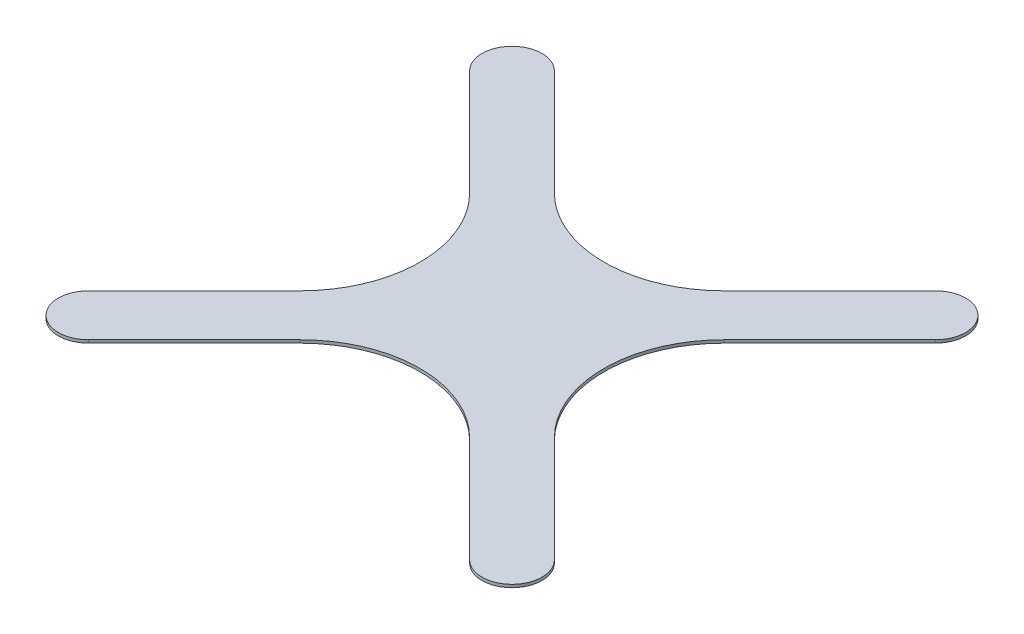
ISO-10303-21;
HEADER;
FILE_DESCRIPTION(('STEP AP214'),'2;1');
FILE_NAME('part.step','',(''),(''),'','','');
FILE_SCHEMA(('AUTOMOTIVE_DESIGN { 1 0 10303 214 1 1 1 1 }'));
ENDSEC;
DATA;
#1=APPLICATION_CONTEXT('core data for automotive mechanical design processes');
#2=APPLICATION_PROTOCOL_DEFINITION('international standard','automotive_design',2000,#1);
#3=PRODUCT_CONTEXT('',#1,'mechanical');
#4=PRODUCT('Part','Part','',(#3));
#5=PRODUCT_RELATED_PRODUCT_CATEGORY('part','',(#4));
#6=PRODUCT_DEFINITION_FORMATION('','',#4);
#7=PRODUCT_DEFINITION_CONTEXT('part definition',#1,'design');
#8=PRODUCT_DEFINITION('design','',#6,#7);
#9=PRODUCT_DEFINITION_SHAPE('','',#8);
#10=(LENGTH_UNIT() NAMED_UNIT(*) SI_UNIT(.MILLI.,.METRE.));
#11=(NAMED_UNIT(*) PLANE_ANGLE_UNIT() SI_UNIT($,.RADIAN.));
#12=(NAMED_UNIT(*) SI_UNIT($,.STERADIAN.) SOLID_ANGLE_UNIT());
#13=UNCERTAINTY_MEASURE_WITH_UNIT(LENGTH_MEASURE(1.E-05),#10,'distance_accuracy_value','');
#14=(GEOMETRIC_REPRESENTATION_CONTEXT(3) GLOBAL_UNCERTAINTY_ASSIGNED_CONTEXT((#13)) GLOBAL_UNIT_ASSIGNED_CONTEXT((#10,
#11,#12)) REPRESENTATION_CONTEXT('',''));
#15=CARTESIAN_POINT('',(0.,0.,0.));
#16=DIRECTION('',(0.,0.,1.));
#17=DIRECTION('',(1.,0.,0.));
#18=AXIS2_PLACEMENT_3D('',#15,#16,#17);
#19=CARTESIAN_POINT('',(-85.583201513365,1.5748,-43.1800000000012));
#20=DIRECTION('',(0.,-1.,0.));
#21=DIRECTION('',(0.,0.,-1.));
#22=AXIS2_PLACEMENT_3D('',#19,#20,#21);
#23=CYLINDRICAL_SURFACE('',#22,63.5);
#24=CARTESIAN_POINT('',(-85.583201513365,0.,-43.1800000000012));
#25=DIRECTION('',(0.,-1.,0.));
#26=DIRECTION('',(0.,0.,1.));
#27=AXIS2_PLACEMENT_3D('',#24,#25,#26);
#28=CIRCLE('',#27,63.5);
#29=CARTESIAN_POINT('',(-40.68192090802,0.,-88.0812806053477));
#30=VERTEX_POINT('',#29);
#31=CARTESIAN_POINT('',(-40.6819209080193,0.,1.72128060534463));
#32=VERTEX_POINT('',#31);
#33=EDGE_CURVE('E181',#30,#32,#28,.T.);
#34=ORIENTED_EDGE('',*,*,#33,.T.);
#35=DIRECTION('',(0.,-1.,0.));
#36=VECTOR('',#35,1.);
#37=CARTESIAN_POINT('',(-40.6819209080193,1.5748,1.72128060534463));
#38=LINE('',#37,#36);
#39=CARTESIAN_POINT('',(-40.6819209080193,1.5748,1.72128060534463));
#40=VERTEX_POINT('',#39);
#41=EDGE_CURVE('E11',#40,#32,#38,.T.);
#42=ORIENTED_EDGE('',*,*,#41,.F.);
#43=CARTESIAN_POINT('',(-85.583201513365,1.5748,-43.1800000000012));
#44=DIRECTION('',(0.,-1.,0.));
#45=DIRECTION('',(0.,0.,1.));
#46=AXIS2_PLACEMENT_3D('',#43,#44,#45);
#47=CIRCLE('',#46,63.5);
#48=CARTESIAN_POINT('',(-40.68192090802,1.5748,-88.0812806053477));
#49=VERTEX_POINT('',#48);
#50=EDGE_CURVE('E211',#49,#40,#47,.T.);
#51=ORIENTED_EDGE('',*,*,#50,.F.);
#52=DIRECTION('',(0.,-1.,0.));
#53=VECTOR('',#52,1.);
#54=CARTESIAN_POINT('',(-40.68192090802,1.5748,-88.0812806053477));
#55=LINE('',#54,#53);
#56=EDGE_CURVE('E177',#49,#30,#55,.T.);
#57=ORIENTED_EDGE('',*,*,#56,.T.);
#58=EDGE_LOOP('',(#34,#42,#51,#57));
#59=FACE_BOUND('',#58,.T.);
#60=ADVANCED_FACE('F37',(#59),#23,.F.);
#61=CARTESIAN_POINT('',(-96.8085216647011,1.5748,57.8478813620271));
#62=DIRECTION('',(0.707106781186552,0.,0.707106781186543));
#63=DIRECTION('',(0.707106781186543,0.,-0.707106781186552));
#64=AXIS2_PLACEMENT_3D('',#61,#62,#63);
#65=PLANE('',#64);
#66=DIRECTION('',(-0.707106781186543,0.,0.707106781186552));
#67=VECTOR('',#66,1.);
#68=CARTESIAN_POINT('',(-96.8085216647011,0.,57.8478813620271));
#69=LINE('',#68,#67);
#70=CARTESIAN_POINT('',(-96.8085216647011,0.,57.8478813620271));
#71=VERTEX_POINT('',#70);
#72=EDGE_CURVE('E184',#32,#71,#69,.T.);
#73=ORIENTED_EDGE('',*,*,#72,.T.);
#74=DIRECTION('',(0.,-1.,0.));
#75=VECTOR('',#74,1.);
#76=CARTESIAN_POINT('',(-96.8085216647011,1.5748,57.8478813620271));
#77=LINE('',#76,#75);
#78=CARTESIAN_POINT('',(-96.8085216647011,1.5748,57.8478813620271));
#79=VERTEX_POINT('',#78);
#80=EDGE_CURVE('E45',#79,#71,#77,.T.);
#81=ORIENTED_EDGE('',*,*,#80,.F.);
#82=DIRECTION('',(-0.707106781186543,0.,0.707106781186552));
#83=VECTOR('',#82,1.);
#84=CARTESIAN_POINT('',(-96.8085216647011,1.5748,57.8478813620271));
#85=LINE('',#84,#83);
#86=EDGE_CURVE('E120',#40,#79,#85,.T.);
#87=ORIENTED_EDGE('',*,*,#86,.F.);
#88=ORIENTED_EDGE('',*,*,#41,.T.);
#89=EDGE_LOOP('',(#73,#81,#87,#88));
#90=FACE_BOUND('',#89,.T.);
#91=ADVANCED_FACE('F309',(#90),#65,.F.);
#92=CARTESIAN_POINT('',(-85.5832015133646,1.5748,69.0732015133635));
#93=DIRECTION('',(0.,-1.,0.));
#94=DIRECTION('',(0.,0.,-1.));
#95=AXIS2_PLACEMENT_3D('',#92,#93,#94);
#96=CYLINDRICAL_SURFACE('',#95,15.875000000002);
#97=CARTESIAN_POINT('',(-85.5832015133646,0.,69.0732015133635));
#98=DIRECTION('',(0.,1.,0.));
#99=DIRECTION('',(0.,0.,1.));
#100=AXIS2_PLACEMENT_3D('',#97,#98,#99);
#101=CIRCLE('',#100,15.875000000002);
#102=CARTESIAN_POINT('',(-74.3578813620274,0.,80.298521664702));
#103=VERTEX_POINT('',#102);
#104=EDGE_CURVE('E186',#71,#103,#101,.T.);
#105=ORIENTED_EDGE('',*,*,#104,.T.);
#106=DIRECTION('',(0.,-1.,0.));
#107=VECTOR('',#106,1.);
#108=CARTESIAN_POINT('',(-74.3578813620274,1.5748,80.298521664702));
#109=LINE('',#108,#107);
#110=CARTESIAN_POINT('',(-74.3578813620274,1.5748,80.298521664702));
#111=VERTEX_POINT('',#110);
#112=EDGE_CURVE('E242',#111,#103,#109,.T.);
#113=ORIENTED_EDGE('',*,*,#112,.F.);
#114=CARTESIAN_POINT('',(-85.5832015133646,1.5748,69.0732015133635));
#115=DIRECTION('',(0.,1.,0.));
#116=DIRECTION('',(0.,0.,1.));
#117=AXIS2_PLACEMENT_3D('',#114,#115,#116);
#118=CIRCLE('',#117,15.875000000002);
#119=EDGE_CURVE('E250',#79,#111,#118,.T.);
#120=ORIENTED_EDGE('',*,*,#119,.F.);
#121=ORIENTED_EDGE('',*,*,#80,.T.);
#122=EDGE_LOOP('',(#105,#113,#120,#121));
#123=FACE_BOUND('',#122,.T.);
#124=ADVANCED_FACE('F248',(#123),#96,.T.);
#125=CARTESIAN_POINT('',(-74.357881362026,1.5748,80.2985216647034));
#126=DIRECTION('',(-0.707106781186556,0.,-0.707106781186539));
#127=DIRECTION('',(-0.707106781186539,0.,0.707106781186556));
#128=AXIS2_PLACEMENT_3D('',#125,#126,#127);
#129=PLANE('',#128);
#130=DIRECTION('',(0.707106781186539,0.,-0.707106781186556));
#131=VECTOR('',#130,1.);
#132=CARTESIAN_POINT('',(-74.357881362026,0.,80.2985216647034));
#133=LINE('',#132,#131);
#134=CARTESIAN_POINT('',(-18.2312806053446,0.,24.1719209080206));
#135=VERTEX_POINT('',#134);
#136=EDGE_CURVE('E188',#103,#135,#133,.T.);
#137=ORIENTED_EDGE('',*,*,#136,.T.);
#138=DIRECTION('',(0.,-1.,0.));
#139=VECTOR('',#138,1.);
#140=CARTESIAN_POINT('',(-18.2312806053446,1.5748,24.1719209080206));
#141=LINE('',#140,#139);
#142=CARTESIAN_POINT('',(-18.2312806053446,1.5748,24.1719209080206));
#143=VERTEX_POINT('',#142);
#144=EDGE_CURVE('E239',#143,#135,#141,.T.);
#145=ORIENTED_EDGE('',*,*,#144,.F.);
#146=DIRECTION('',(0.707106781186539,0.,-0.707106781186556));
#147=VECTOR('',#146,1.);
#148=CARTESIAN_POINT('',(-74.357881362026,1.5748,80.2985216647034));
#149=LINE('',#148,#147);
#150=EDGE_CURVE('E268',#111,#143,#149,.T.);
#151=ORIENTED_EDGE('',*,*,#150,.F.);
#152=ORIENTED_EDGE('',*,*,#112,.T.);
#153=EDGE_LOOP('',(#137,#145,#151,#152));
#154=FACE_BOUND('',#153,.T.);
#155=ADVANCED_FACE('F259',(#154),#129,.F.);
#156=CARTESIAN_POINT('',(26.670000000002,1.5748,69.0732015133655));
#157=DIRECTION('',(0.,-1.,0.));
#158=DIRECTION('',(0.,0.,-1.));
#159=AXIS2_PLACEMENT_3D('',#156,#157,#158);
#160=CYLINDRICAL_SURFACE('',#159,63.5);
#161=CARTESIAN_POINT('',(26.670000000002,0.,69.0732015133655));
#162=DIRECTION('',(0.,-1.,0.));
#163=DIRECTION('',(0.,0.,-1.));
#164=AXIS2_PLACEMENT_3D('',#161,#162,#163);
#165=CIRCLE('',#164,63.5);
#166=CARTESIAN_POINT('',(71.5712806053497,0.,24.1719209080217));
#167=VERTEX_POINT('',#166);
#168=EDGE_CURVE('E190',#135,#167,#165,.T.);
#169=ORIENTED_EDGE('',*,*,#168,.T.);
#170=DIRECTION('',(0.,-1.,0.));
#171=VECTOR('',#170,1.);
#172=CARTESIAN_POINT('',(71.5712806053497,1.5748,24.1719209080217));
#173=LINE('',#172,#171);
#174=CARTESIAN_POINT('',(71.5712806053497,1.5748,24.1719209080217));
#175=VERTEX_POINT('',#174);
#176=EDGE_CURVE('E236',#175,#167,#173,.T.);
#177=ORIENTED_EDGE('',*,*,#176,.F.);
#178=CARTESIAN_POINT('',(26.670000000002,1.5748,69.0732015133655));
#179=DIRECTION('',(0.,-1.,0.));
#180=DIRECTION('',(0.,0.,-1.));
#181=AXIS2_PLACEMENT_3D('',#178,#179,#180);
#182=CIRCLE('',#181,63.5);
#183=EDGE_CURVE('E265',#143,#175,#182,.T.);
#184=ORIENTED_EDGE('',*,*,#183,.F.);
#185=ORIENTED_EDGE('',*,*,#144,.T.);
#186=EDGE_LOOP('',(#169,#177,#184,#185));
#187=FACE_BOUND('',#186,.T.);
#188=ADVANCED_FACE('F263',(#187),#160,.F.);
#189=CARTESIAN_POINT('',(127.69788136203,1.5748,80.2985216647022));
#190=DIRECTION('',(0.707106781186548,0.,-0.707106781186548));
#191=DIRECTION('',(-0.707106781186548,0.,-0.707106781186548));
#192=AXIS2_PLACEMENT_3D('',#189,#190,#191);
#193=PLANE('',#192);
#194=DIRECTION('',(0.707106781186548,0.,0.707106781186548));
#195=VECTOR('',#194,1.);
#196=CARTESIAN_POINT('',(127.69788136203,0.,80.2985216647022));
#197=LINE('',#196,#195);
#198=CARTESIAN_POINT('',(127.69788136203,0.,80.2985216647022));
#199=VERTEX_POINT('',#198);
#200=EDGE_CURVE('E192',#167,#199,#197,.T.);
#201=ORIENTED_EDGE('',*,*,#200,.T.);
#202=DIRECTION('',(0.,-1.,0.));
#203=VECTOR('',#202,1.);
#204=CARTESIAN_POINT('',(127.69788136203,1.5748,80.2985216647022));
#205=LINE('',#204,#203);
#206=CARTESIAN_POINT('',(127.69788136203,1.5748,80.2985216647022));
#207=VERTEX_POINT('',#206);
#208=EDGE_CURVE('E233',#207,#199,#205,.T.);
#209=ORIENTED_EDGE('',*,*,#208,.F.);
#210=DIRECTION('',(0.707106781186548,0.,0.707106781186548));
#211=VECTOR('',#210,1.);
#212=CARTESIAN_POINT('',(127.69788136203,1.5748,80.2985216647022));
#213=LINE('',#212,#211);
#214=EDGE_CURVE('E267',#175,#207,#213,.T.);
#215=ORIENTED_EDGE('',*,*,#214,.F.);
#216=ORIENTED_EDGE('',*,*,#176,.T.);
#217=EDGE_LOOP('',(#201,#209,#215,#216));
#218=FACE_BOUND('',#217,.T.);
#219=ADVANCED_FACE('F322',(#218),#193,.F.);
#220=CARTESIAN_POINT('',(138.923201513364,1.5748,69.0732015133626));
#221=DIRECTION('',(0.,-1.,0.));
#222=DIRECTION('',(0.,0.,-1.));
#223=AXIS2_PLACEMENT_3D('',#220,#221,#222);
#224=CYLINDRICAL_SURFACE('',#223,15.8749999999999);
#225=CARTESIAN_POINT('',(138.923201513364,0.,69.0732015133626));
#226=DIRECTION('',(0.,1.,0.));
#227=DIRECTION('',(0.,0.,1.));
#228=AXIS2_PLACEMENT_3D('',#225,#226,#227);
#229=CIRCLE('',#228,15.8749999999999);
#230=CARTESIAN_POINT('',(150.148521664701,0.,57.847881362027));
#231=VERTEX_POINT('',#230);
#232=EDGE_CURVE('E194',#199,#231,#229,.T.);
#233=ORIENTED_EDGE('',*,*,#232,.T.);
#234=DIRECTION('',(0.,-1.,0.));
#235=VECTOR('',#234,1.);
#236=CARTESIAN_POINT('',(150.148521664701,1.5748,57.847881362027));
#237=LINE('',#236,#235);
#238=CARTESIAN_POINT('',(150.148521664701,1.5748,57.847881362027));
#239=VERTEX_POINT('',#238);
#240=EDGE_CURVE('E230',#239,#231,#237,.T.);
#241=ORIENTED_EDGE('',*,*,#240,.F.);
#242=CARTESIAN_POINT('',(138.923201513364,1.5748,69.0732015133626));
#243=DIRECTION('',(0.,1.,0.));
#244=DIRECTION('',(0.,0.,1.));
#245=AXIS2_PLACEMENT_3D('',#242,#243,#244);
#246=CIRCLE('',#245,15.8749999999999);
#247=EDGE_CURVE('E270',#207,#239,#246,.T.);
#248=ORIENTED_EDGE('',*,*,#247,.F.);
#249=ORIENTED_EDGE('',*,*,#208,.T.);
#250=EDGE_LOOP('',(#233,#241,#248,#249));
#251=FACE_BOUND('',#250,.T.);
#252=ADVANCED_FACE('F325',(#251),#224,.T.);
#253=CARTESIAN_POINT('',(150.148521664701,1.5748,57.8478813620272));
#254=DIRECTION('',(-0.707106781186537,0.,0.707106781186558));
#255=DIRECTION('',(0.707106781186558,0.,0.707106781186537));
#256=AXIS2_PLACEMENT_3D('',#253,#254,#255);
#257=PLANE('',#256);
#258=DIRECTION('',(-0.707106781186558,0.,-0.707106781186537));
#259=VECTOR('',#258,1.);
#260=CARTESIAN_POINT('',(150.148521664701,0.,57.8478813620272));
#261=LINE('',#260,#259);
#262=CARTESIAN_POINT('',(94.0219209080193,0.,1.72128060534754));
#263=VERTEX_POINT('',#262);
#264=EDGE_CURVE('E196',#231,#263,#261,.T.);
#265=ORIENTED_EDGE('',*,*,#264,.T.);
#266=DIRECTION('',(0.,-1.,0.));
#267=VECTOR('',#266,1.);
#268=CARTESIAN_POINT('',(94.0219209080193,1.5748,1.72128060534754));
#269=LINE('',#268,#267);
#270=CARTESIAN_POINT('',(94.0219209080193,1.5748,1.72128060534754));
#271=VERTEX_POINT('',#270);
#272=EDGE_CURVE('E227',#271,#263,#269,.T.);
#273=ORIENTED_EDGE('',*,*,#272,.F.);
#274=DIRECTION('',(-0.707106781186558,0.,-0.707106781186537));
#275=VECTOR('',#274,1.);
#276=CARTESIAN_POINT('',(150.148521664701,1.5748,57.8478813620272));
#277=LINE('',#276,#275);
#278=EDGE_CURVE('E276',#239,#271,#277,.T.);
#279=ORIENTED_EDGE('',*,*,#278,.F.);
#280=ORIENTED_EDGE('',*,*,#240,.T.);
#281=EDGE_LOOP('',(#265,#273,#279,#280));
#282=FACE_BOUND('',#281,.T.);
#283=ADVANCED_FACE('F329',(#282),#257,.F.);
#284=CARTESIAN_POINT('',(138.923201513364,1.5748,-43.1799999999992));
#285=DIRECTION('',(0.,-1.,0.));
#286=DIRECTION('',(0.,0.,-1.));
#287=AXIS2_PLACEMENT_3D('',#284,#285,#286);
#288=CYLINDRICAL_SURFACE('',#287,63.5);
#289=CARTESIAN_POINT('',(138.923201513364,0.,-43.1799999999992));
#290=DIRECTION('',(0.,-1.,0.));
#291=DIRECTION('',(0.,0.,1.));
#292=AXIS2_PLACEMENT_3D('',#289,#290,#291);
#293=CIRCLE('',#292,63.5);
#294=CARTESIAN_POINT('',(94.0219209080209,0.,-88.0812806053475));
#295=VERTEX_POINT('',#294);
#296=EDGE_CURVE('E198',#263,#295,#293,.T.);
#297=ORIENTED_EDGE('',*,*,#296,.T.);
#298=DIRECTION('',(0.,-1.,0.));
#299=VECTOR('',#298,1.);
#300=CARTESIAN_POINT('',(94.0219209080209,1.5748,-88.0812806053475));
#301=LINE('',#300,#299);
#302=CARTESIAN_POINT('',(94.0219209080209,1.5748,-88.0812806053475));
#303=VERTEX_POINT('',#302);
#304=EDGE_CURVE('E224',#303,#295,#301,.T.);
#305=ORIENTED_EDGE('',*,*,#304,.F.);
#306=CARTESIAN_POINT('',(138.923201513364,1.5748,-43.1799999999992));
#307=DIRECTION('',(0.,-1.,0.));
#308=DIRECTION('',(0.,0.,1.));
#309=AXIS2_PLACEMENT_3D('',#306,#307,#308);
#310=CIRCLE('',#309,63.5);
#311=EDGE_CURVE('E278',#271,#303,#310,.T.);
#312=ORIENTED_EDGE('',*,*,#311,.F.);
#313=ORIENTED_EDGE('',*,*,#272,.T.);
#314=EDGE_LOOP('',(#297,#305,#312,#313));
#315=FACE_BOUND('',#314,.T.);
#316=ADVANCED_FACE('F333',(#315),#288,.F.);
#317=CARTESIAN_POINT('',(150.148521664703,1.5748,-144.20788136203));
#318=DIRECTION('',(-0.707106781186548,0.,-0.707106781186547));
#319=DIRECTION('',(-0.707106781186547,0.,0.707106781186548));
#320=AXIS2_PLACEMENT_3D('',#317,#318,#319);
#321=PLANE('',#320);
#322=DIRECTION('',(0.707106781186547,0.,-0.707106781186548));
#323=VECTOR('',#322,1.);
#324=CARTESIAN_POINT('',(150.148521664703,0.,-144.20788136203));
#325=LINE('',#324,#323);
#326=CARTESIAN_POINT('',(150.148521664703,0.,-144.20788136203));
#327=VERTEX_POINT('',#326);
#328=EDGE_CURVE('E200',#295,#327,#325,.T.);
#329=ORIENTED_EDGE('',*,*,#328,.T.);
#330=DIRECTION('',(0.,-1.,0.));
#331=VECTOR('',#330,1.);
#332=CARTESIAN_POINT('',(150.148521664703,1.5748,-144.20788136203));
#333=LINE('',#332,#331);
#334=CARTESIAN_POINT('',(150.148521664703,1.5748,-144.20788136203));
#335=VERTEX_POINT('',#334);
#336=EDGE_CURVE('E221',#335,#327,#333,.T.);
#337=ORIENTED_EDGE('',*,*,#336,.F.);
#338=DIRECTION('',(0.707106781186547,0.,-0.707106781186548));
#339=VECTOR('',#338,1.);
#340=CARTESIAN_POINT('',(150.148521664703,1.5748,-144.20788136203));
#341=LINE('',#340,#339);
#342=EDGE_CURVE('E280',#303,#335,#341,.T.);
#343=ORIENTED_EDGE('',*,*,#342,.F.);
#344=ORIENTED_EDGE('',*,*,#304,.T.);
#345=EDGE_LOOP('',(#329,#337,#343,#344));
#346=FACE_BOUND('',#345,.T.);
#347=ADVANCED_FACE('F337',(#346),#321,.F.);
#348=CARTESIAN_POINT('',(138.923201513364,1.5748,-155.433201513365));
#349=DIRECTION('',(0.,-1.,0.));
#350=DIRECTION('',(0.,0.,-1.));
#351=AXIS2_PLACEMENT_3D('',#348,#349,#350);
#352=CYLINDRICAL_SURFACE('',#351,15.8750000000007);
#353=CARTESIAN_POINT('',(138.923201513364,0.,-155.433201513365));
#354=DIRECTION('',(0.,1.,0.));
#355=DIRECTION('',(0.,0.,1.));
#356=AXIS2_PLACEMENT_3D('',#353,#354,#355);
#357=CIRCLE('',#356,15.8750000000007);
#358=CARTESIAN_POINT('',(127.697881362028,0.,-166.658521664703));
#359=VERTEX_POINT('',#358);
#360=EDGE_CURVE('E202',#327,#359,#357,.T.);
#361=ORIENTED_EDGE('',*,*,#360,.T.);
#362=DIRECTION('',(0.,-1.,0.));
#363=VECTOR('',#362,1.);
#364=CARTESIAN_POINT('',(127.697881362028,1.5748,-166.658521664703));
#365=LINE('',#364,#363);
#366=CARTESIAN_POINT('',(127.697881362028,1.5748,-166.658521664703));
#367=VERTEX_POINT('',#366);
#368=EDGE_CURVE('E218',#367,#359,#365,.T.);
#369=ORIENTED_EDGE('',*,*,#368,.F.);
#370=CARTESIAN_POINT('',(138.923201513364,1.5748,-155.433201513365));
#371=DIRECTION('',(0.,1.,0.));
#372=DIRECTION('',(0.,0.,1.));
#373=AXIS2_PLACEMENT_3D('',#370,#371,#372);
#374=CIRCLE('',#373,15.8750000000007);
#375=EDGE_CURVE('E282',#335,#367,#374,.T.);
#376=ORIENTED_EDGE('',*,*,#375,.F.);
#377=ORIENTED_EDGE('',*,*,#336,.T.);
#378=EDGE_LOOP('',(#361,#369,#376,#377));
#379=FACE_BOUND('',#378,.T.);
#380=ADVANCED_FACE('F341',(#379),#352,.T.);
#381=CARTESIAN_POINT('',(127.697881362028,1.5748,-166.658521664703));
#382=DIRECTION('',(0.707106781186548,0.,0.707106781186548));
#383=DIRECTION('',(0.707106781186548,0.,-0.707106781186548));
#384=AXIS2_PLACEMENT_3D('',#381,#382,#383);
#385=PLANE('',#384);
#386=DIRECTION('',(-0.707106781186548,0.,0.707106781186548));
#387=VECTOR('',#386,1.);
#388=CARTESIAN_POINT('',(127.697881362028,0.,-166.658521664703));
#389=LINE('',#388,#387);
#390=CARTESIAN_POINT('',(71.5712806053461,0.,-110.53192090802));
#391=VERTEX_POINT('',#390);
#392=EDGE_CURVE('E204',#359,#391,#389,.T.);
#393=ORIENTED_EDGE('',*,*,#392,.T.);
#394=DIRECTION('',(0.,-1.,0.));
#395=VECTOR('',#394,1.);
#396=CARTESIAN_POINT('',(71.5712806053461,1.5748,-110.53192090802));
#397=LINE('',#396,#395);
#398=CARTESIAN_POINT('',(71.5712806053461,1.5748,-110.53192090802));
#399=VERTEX_POINT('',#398);
#400=EDGE_CURVE('E215',#399,#391,#397,.T.);
#401=ORIENTED_EDGE('',*,*,#400,.F.);
#402=DIRECTION('',(-0.707106781186548,0.,0.707106781186548));
#403=VECTOR('',#402,1.);
#404=CARTESIAN_POINT('',(127.697881362028,1.5748,-166.658521664703));
#405=LINE('',#404,#403);
#406=EDGE_CURVE('E284',#367,#399,#405,.T.);
#407=ORIENTED_EDGE('',*,*,#406,.F.);
#408=ORIENTED_EDGE('',*,*,#368,.T.);
#409=EDGE_LOOP('',(#393,#401,#407,#408));
#410=FACE_BOUND('',#409,.T.);
#411=ADVANCED_FACE('F290',(#410),#385,.F.);
#412=CARTESIAN_POINT('',(26.6699999999985,1.5748,-155.433201513364));
#413=DIRECTION('',(0.,-1.,0.));
#414=DIRECTION('',(0.,0.,-1.));
#415=AXIS2_PLACEMENT_3D('',#412,#413,#414);
#416=CYLINDRICAL_SURFACE('',#415,63.5);
#417=CARTESIAN_POINT('',(26.6699999999985,0.,-155.433201513364));
#418=DIRECTION('',(0.,-1.,0.));
#419=DIRECTION('',(0.,0.,-1.));
#420=AXIS2_PLACEMENT_3D('',#417,#418,#419);
#421=CIRCLE('',#420,63.5);
#422=CARTESIAN_POINT('',(-18.2312806053481,0.,-110.531920908019));
#423=VERTEX_POINT('',#422);
#424=EDGE_CURVE('E206',#391,#423,#421,.T.);
#425=ORIENTED_EDGE('',*,*,#424,.T.);
#426=DIRECTION('',(0.,-1.,0.));
#427=VECTOR('',#426,1.);
#428=CARTESIAN_POINT('',(-18.2312806053481,1.5748,-110.531920908019));
#429=LINE('',#428,#427);
#430=CARTESIAN_POINT('',(-18.2312806053481,1.5748,-110.531920908019));
#431=VERTEX_POINT('',#430);
#432=EDGE_CURVE('E172',#431,#423,#429,.T.);
#433=ORIENTED_EDGE('',*,*,#432,.F.);
#434=CARTESIAN_POINT('',(26.6699999999985,1.5748,-155.433201513364));
#435=DIRECTION('',(0.,-1.,0.));
#436=DIRECTION('',(0.,0.,-1.));
#437=AXIS2_PLACEMENT_3D('',#434,#435,#436);
#438=CIRCLE('',#437,63.5);
#439=EDGE_CURVE('E163',#399,#431,#438,.T.);
#440=ORIENTED_EDGE('',*,*,#439,.F.);
#441=ORIENTED_EDGE('',*,*,#400,.T.);
#442=EDGE_LOOP('',(#425,#433,#440,#441));
#443=FACE_BOUND('',#442,.T.);
#444=ADVANCED_FACE('F294',(#443),#416,.F.);
#445=CARTESIAN_POINT('',(-74.357881362028,1.5748,-166.658521664701));
#446=DIRECTION('',(-0.707106781186556,0.,0.70710678118654));
#447=DIRECTION('',(0.70710678118654,0.,0.707106781186556));
#448=AXIS2_PLACEMENT_3D('',#445,#446,#447);
#449=PLANE('',#448);
#450=DIRECTION('',(-0.70710678118654,0.,-0.707106781186555));
#451=VECTOR('',#450,1.);
#452=CARTESIAN_POINT('',(-74.357881362028,0.,-166.658521664701));
#453=LINE('',#452,#451);
#454=CARTESIAN_POINT('',(-74.357881362028,0.,-166.658521664701));
#455=VERTEX_POINT('',#454);
#456=EDGE_CURVE('E171',#423,#455,#453,.T.);
#457=ORIENTED_EDGE('',*,*,#456,.T.);
#458=DIRECTION('',(0.,-1.,0.));
#459=VECTOR('',#458,1.);
#460=CARTESIAN_POINT('',(-74.357881362028,1.5748,-166.658521664701));
#461=LINE('',#460,#459);
#462=CARTESIAN_POINT('',(-74.357881362028,1.5748,-166.658521664701));
#463=VERTEX_POINT('',#462);
#464=EDGE_CURVE('E168',#463,#455,#461,.T.);
#465=ORIENTED_EDGE('',*,*,#464,.F.);
#466=DIRECTION('',(-0.70710678118654,0.,-0.707106781186555));
#467=VECTOR('',#466,1.);
#468=CARTESIAN_POINT('',(-74.357881362028,1.5748,-166.658521664701));
#469=LINE('',#468,#467);
#470=EDGE_CURVE('E157',#431,#463,#469,.T.);
#471=ORIENTED_EDGE('',*,*,#470,.F.);
#472=ORIENTED_EDGE('',*,*,#432,.T.);
#473=EDGE_LOOP('',(#457,#465,#471,#472));
#474=FACE_BOUND('',#473,.T.);
#475=ADVANCED_FACE('F169',(#474),#449,.F.);
#476=CARTESIAN_POINT('',(-85.5832015133619,1.5748,-155.433201513362));
#477=DIRECTION('',(0.,-1.,0.));
#478=DIRECTION('',(0.,0.,-1.));
#479=AXIS2_PLACEMENT_3D('',#476,#477,#478);
#480=CYLINDRICAL_SURFACE('',#479,15.8749999999997);
#481=CARTESIAN_POINT('',(-85.5832015133619,0.,-155.433201513362));
#482=DIRECTION('',(0.,1.,0.));
#483=DIRECTION('',(0.,0.,1.));
#484=AXIS2_PLACEMENT_3D('',#481,#482,#483);
#485=CIRCLE('',#484,15.8749999999997);
#486=CARTESIAN_POINT('',(-96.8085216646981,0.,-144.207881362026));
#487=VERTEX_POINT('',#486);
#488=EDGE_CURVE('E106',#455,#487,#485,.T.);
#489=ORIENTED_EDGE('',*,*,#488,.T.);
#490=DIRECTION('',(0.,-1.,0.));
#491=VECTOR('',#490,1.);
#492=CARTESIAN_POINT('',(-96.8085216646981,1.5748,-144.207881362026));
#493=LINE('',#492,#491);
#494=CARTESIAN_POINT('',(-96.8085216646981,1.5748,-144.207881362026));
#495=VERTEX_POINT('',#494);
#496=EDGE_CURVE('E173',#495,#487,#493,.T.);
#497=ORIENTED_EDGE('',*,*,#496,.F.);
#498=CARTESIAN_POINT('',(-85.5832015133619,1.5748,-155.433201513362));
#499=DIRECTION('',(0.,1.,0.));
#500=DIRECTION('',(0.,0.,1.));
#501=AXIS2_PLACEMENT_3D('',#498,#499,#500);
#502=CIRCLE('',#501,15.8749999999997);
#503=EDGE_CURVE('E161',#463,#495,#502,.T.);
#504=ORIENTED_EDGE('',*,*,#503,.F.);
#505=ORIENTED_EDGE('',*,*,#464,.T.);
#506=EDGE_LOOP('',(#489,#497,#504,#505));
#507=FACE_BOUND('',#506,.T.);
#508=ADVANCED_FACE('F175',(#507),#480,.T.);
#509=CARTESIAN_POINT('',(-96.8085216646983,1.5748,-144.207881362026));
#510=DIRECTION('',(0.707106781186547,0.,-0.707106781186548));
#511=DIRECTION('',(-0.707106781186548,0.,-0.707106781186547));
#512=AXIS2_PLACEMENT_3D('',#509,#510,#511);
#513=PLANE('',#512);
#514=DIRECTION('',(0.707106781186548,0.,0.707106781186547));
#515=VECTOR('',#514,1.);
#516=CARTESIAN_POINT('',(-96.8085216646983,0.,-144.207881362026));
#517=LINE('',#516,#515);
#518=EDGE_CURVE('E112',#487,#30,#517,.T.);
#519=ORIENTED_EDGE('',*,*,#518,.T.);
#520=ORIENTED_EDGE('',*,*,#56,.F.);
#521=DIRECTION('',(0.707106781186548,0.,0.707106781186547));
#522=VECTOR('',#521,1.);
#523=CARTESIAN_POINT('',(-96.8085216646983,1.5748,-144.207881362026));
#524=LINE('',#523,#522);
#525=EDGE_CURVE('E53',#495,#49,#524,.T.);
#526=ORIENTED_EDGE('',*,*,#525,.F.);
#527=ORIENTED_EDGE('',*,*,#496,.T.);
#528=EDGE_LOOP('',(#519,#520,#526,#527));
#529=FACE_BOUND('',#528,.T.);
#530=ADVANCED_FACE('F298',(#529),#513,.F.);
#531=CARTESIAN_POINT('',(-85.583201513365,1.5748,-43.1800000000012));
#532=DIRECTION('',(0.,1.,0.));
#533=DIRECTION('',(0.,0.,1.));
#534=AXIS2_PLACEMENT_3D('',#531,#532,#533);
#535=PLANE('',#534);
#536=ORIENTED_EDGE('',*,*,#50,.T.);
#537=ORIENTED_EDGE('',*,*,#86,.T.);
#538=ORIENTED_EDGE('',*,*,#119,.T.);
#539=ORIENTED_EDGE('',*,*,#150,.T.);
#540=ORIENTED_EDGE('',*,*,#183,.T.);
#541=ORIENTED_EDGE('',*,*,#214,.T.);
#542=ORIENTED_EDGE('',*,*,#247,.T.);
#543=ORIENTED_EDGE('',*,*,#278,.T.);
#544=ORIENTED_EDGE('',*,*,#311,.T.);
#545=ORIENTED_EDGE('',*,*,#342,.T.);
#546=ORIENTED_EDGE('',*,*,#375,.T.);
#547=ORIENTED_EDGE('',*,*,#406,.T.);
#548=ORIENTED_EDGE('',*,*,#439,.T.);
#549=ORIENTED_EDGE('',*,*,#470,.T.);
#550=ORIENTED_EDGE('',*,*,#503,.T.);
#551=ORIENTED_EDGE('',*,*,#525,.T.);
#552=EDGE_LOOP('',(#536,#537,#538,#539,#540,#541,#542,#543,#544,#545,#546,#547,#548,#549,#550,#551));
#553=FACE_BOUND('',#552,.T.);
#554=ADVANCED_FACE('F159',(#553),#535,.T.);
#555=CARTESIAN_POINT('',(-85.583201513365,0.,-43.1800000000012));
#556=DIRECTION('',(0.,1.,0.));
#557=DIRECTION('',(0.,0.,1.));
#558=AXIS2_PLACEMENT_3D('',#555,#556,#557);
#559=PLANE('',#558);
#560=ORIENTED_EDGE('',*,*,#33,.F.);
#561=ORIENTED_EDGE('',*,*,#518,.F.);
#562=ORIENTED_EDGE('',*,*,#488,.F.);
#563=ORIENTED_EDGE('',*,*,#456,.F.);
#564=ORIENTED_EDGE('',*,*,#424,.F.);
#565=ORIENTED_EDGE('',*,*,#392,.F.);
#566=ORIENTED_EDGE('',*,*,#360,.F.);
#567=ORIENTED_EDGE('',*,*,#328,.F.);
#568=ORIENTED_EDGE('',*,*,#296,.F.);
#569=ORIENTED_EDGE('',*,*,#264,.F.);
#570=ORIENTED_EDGE('',*,*,#232,.F.);
#571=ORIENTED_EDGE('',*,*,#200,.F.);
#572=ORIENTED_EDGE('',*,*,#168,.F.);
#573=ORIENTED_EDGE('',*,*,#136,.F.);
#574=ORIENTED_EDGE('',*,*,#104,.F.);
#575=ORIENTED_EDGE('',*,*,#72,.F.);
#576=EDGE_LOOP('',(#560,#561,#562,#563,#564,#565,#566,#567,#568,#569,#570,#571,#572,#573,#574,#575));
#577=FACE_BOUND('',#576,.T.);
#578=ADVANCED_FACE('F254',(#577),#559,.F.);
#579=CLOSED_SHELL('',(#60,#91,#124,#155,#188,#219,#252,#283,#316,#347,#380,#411,#444,#475,#508,
#530,#554,#578));
#580=MANIFOLD_SOLID_BREP('B2',#579);
#581=ADVANCED_BREP_SHAPE_REPRESENTATION('',(#18,#580),#14);
#582=SHAPE_DEFINITION_REPRESENTATION(#9,#581);
ENDSEC;
END-ISO-10303-21;
